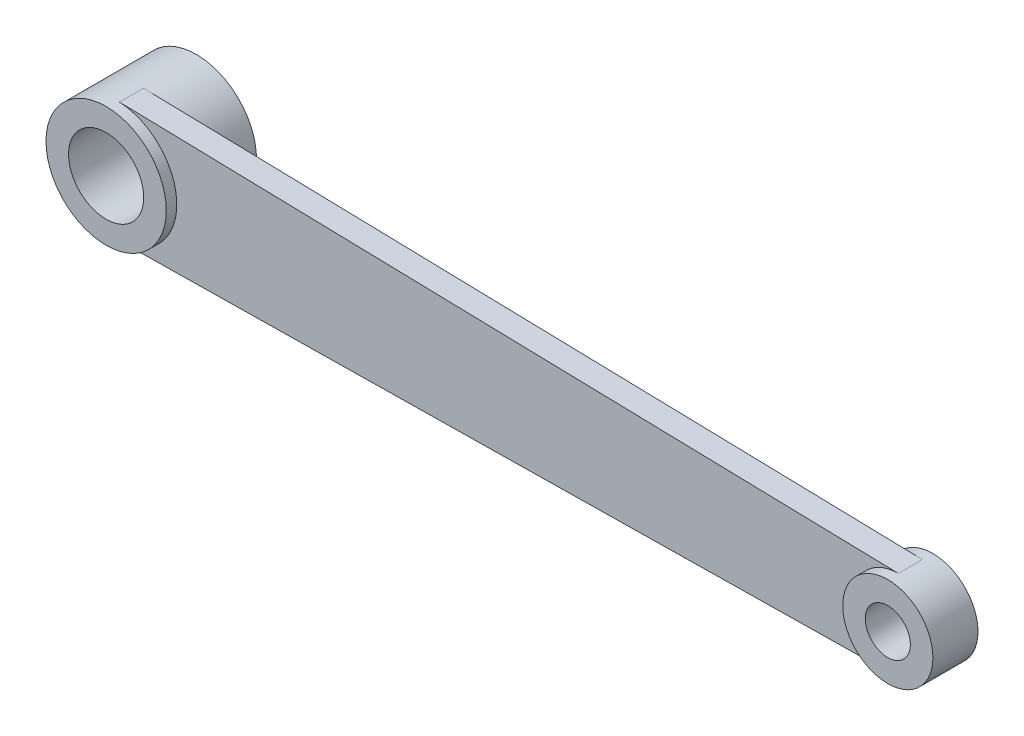
ISO-10303-21;
HEADER;
FILE_DESCRIPTION(('STEP AP214'),'2;1');
FILE_NAME('part.step','',(''),(''),'','','');
FILE_SCHEMA(('AUTOMOTIVE_DESIGN { 1 0 10303 214 1 1 1 1 }'));
ENDSEC;
DATA;
#1=APPLICATION_CONTEXT('core data for automotive mechanical design processes');
#2=APPLICATION_PROTOCOL_DEFINITION('international standard','automotive_design',2000,#1);
#3=PRODUCT_CONTEXT('',#1,'mechanical');
#4=PRODUCT('Part','Part','',(#3));
#5=PRODUCT_RELATED_PRODUCT_CATEGORY('part','',(#4));
#6=PRODUCT_DEFINITION_FORMATION('','',#4);
#7=PRODUCT_DEFINITION_CONTEXT('part definition',#1,'design');
#8=PRODUCT_DEFINITION('design','',#6,#7);
#9=PRODUCT_DEFINITION_SHAPE('','',#8);
#10=(LENGTH_UNIT() NAMED_UNIT(*) SI_UNIT(.MILLI.,.METRE.));
#11=(NAMED_UNIT(*) PLANE_ANGLE_UNIT() SI_UNIT($,.RADIAN.));
#12=(NAMED_UNIT(*) SI_UNIT($,.STERADIAN.) SOLID_ANGLE_UNIT());
#13=UNCERTAINTY_MEASURE_WITH_UNIT(LENGTH_MEASURE(1.E-05),#10,'distance_accuracy_value','');
#14=(GEOMETRIC_REPRESENTATION_CONTEXT(3) GLOBAL_UNCERTAINTY_ASSIGNED_CONTEXT((#13)) GLOBAL_UNIT_ASSIGNED_CONTEXT((#10,
#11,#12)) REPRESENTATION_CONTEXT('',''));
#15=CARTESIAN_POINT('',(0.,0.,0.));
#16=DIRECTION('',(0.,0.,1.));
#17=DIRECTION('',(1.,0.,0.));
#18=AXIS2_PLACEMENT_3D('',#15,#16,#17);
#19=CARTESIAN_POINT('',(0.365782486916927,15.1615884199877,4.));
#20=DIRECTION('',(0.0241185865450105,0.999709104581463,0.));
#21=DIRECTION('',(-0.999709104581463,0.0241185865450105,0.));
#22=AXIS2_PLACEMENT_3D('',#19,#20,#21);
#23=PLANE('',#22);
#24=DIRECTION('',(0.999709104581463,-0.0241185865450105,0.));
#25=VECTOR('',#24,1.);
#26=CARTESIAN_POINT('',(0.365782486916927,15.1615884199877,-4.));
#27=LINE('',#26,#25);
#28=CARTESIAN_POINT('',(-199.220649297423,19.9767317513228,-4.));
#29=VERTEX_POINT('',#28);
#30=CARTESIAN_POINT('',(59.8148878802298,13.7273428110589,-4.));
#31=VERTEX_POINT('',#30);
#32=EDGE_CURVE('E91',#29,#31,#27,.T.);
#33=ORIENTED_EDGE('',*,*,#32,.F.);
#34=DIRECTION('',(0.,0.,-1.));
#35=VECTOR('',#34,1.);
#36=CARTESIAN_POINT('',(-199.220649297423,19.9767317513228,4.));
#37=LINE('',#36,#35);
#38=CARTESIAN_POINT('',(-199.220649297423,19.9767317513228,4.));
#39=VERTEX_POINT('',#38);
#40=EDGE_CURVE('E53',#39,#29,#37,.T.);
#41=ORIENTED_EDGE('',*,*,#40,.F.);
#42=DIRECTION('',(0.999709104581463,-0.0241185865450105,0.));
#43=VECTOR('',#42,1.);
#44=CARTESIAN_POINT('',(0.365782486916927,15.1615884199877,4.));
#45=LINE('',#44,#43);
#46=CARTESIAN_POINT('',(59.8148878802297,13.7273428110589,4.));
#47=VERTEX_POINT('',#46);
#48=EDGE_CURVE('E98',#39,#47,#45,.T.);
#49=ORIENTED_EDGE('',*,*,#48,.T.);
#50=DIRECTION('',(0.,0.,-1.));
#51=VECTOR('',#50,1.);
#52=CARTESIAN_POINT('',(59.8148878802298,13.7273428110589,4.));
#53=LINE('',#52,#51);
#54=EDGE_CURVE('E12',#47,#31,#53,.T.);
#55=ORIENTED_EDGE('',*,*,#54,.T.);
#56=EDGE_LOOP('',(#33,#41,#49,#55));
#57=FACE_BOUND('',#56,.T.);
#58=ADVANCED_FACE('F45',(#57),#23,.T.);
#59=CARTESIAN_POINT('',(0.245526373288944,-17.1266396172959,4.));
#60=DIRECTION('',(-0.0143344609623184,0.99989725633633,0.));
#61=DIRECTION('',(-0.99989725633633,-0.0143344609623184,0.));
#62=AXIS2_PLACEMENT_3D('',#59,#60,#61);
#63=PLANE('',#62);
#64=DIRECTION('',(0.99989725633633,0.0143344609623184,0.));
#65=VECTOR('',#64,1.);
#66=CARTESIAN_POINT('',(0.245526373288944,-17.1266396172959,-4.));
#67=LINE('',#66,#65);
#68=CARTESIAN_POINT('',(-199.61179259228,-19.9917809291568,-4.));
#69=VERTEX_POINT('',#68);
#70=CARTESIAN_POINT('',(59.8148878802298,-16.2726571889411,-4.));
#71=VERTEX_POINT('',#70);
#72=EDGE_CURVE('E104',#69,#71,#67,.T.);
#73=ORIENTED_EDGE('',*,*,#72,.T.);
#74=DIRECTION('',(0.,0.,-1.));
#75=VECTOR('',#74,1.);
#76=CARTESIAN_POINT('',(59.8148878802298,-16.2726571889411,4.));
#77=LINE('',#76,#75);
#78=CARTESIAN_POINT('',(59.8148878802295,-16.2726571889411,4.));
#79=VERTEX_POINT('',#78);
#80=EDGE_CURVE('E60',#79,#71,#77,.T.);
#81=ORIENTED_EDGE('',*,*,#80,.F.);
#82=DIRECTION('',(0.99989725633633,0.0143344609623184,0.));
#83=VECTOR('',#82,1.);
#84=CARTESIAN_POINT('',(0.245526373288944,-17.1266396172959,4.));
#85=LINE('',#84,#83);
#86=CARTESIAN_POINT('',(-199.611792592279,-19.9917809291568,4.));
#87=VERTEX_POINT('',#86);
#88=EDGE_CURVE('E114',#87,#79,#85,.T.);
#89=ORIENTED_EDGE('',*,*,#88,.F.);
#90=DIRECTION('',(0.,0.,-1.));
#91=VECTOR('',#90,1.);
#92=CARTESIAN_POINT('',(-199.61179259228,-19.9917809291568,4.));
#93=LINE('',#92,#91);
#94=EDGE_CURVE('E113',#87,#69,#93,.T.);
#95=ORIENTED_EDGE('',*,*,#94,.T.);
#96=EDGE_LOOP('',(#73,#81,#89,#95));
#97=FACE_BOUND('',#96,.T.);
#98=ADVANCED_FACE('F173',(#97),#63,.F.);
#99=CARTESIAN_POINT('',(0.,0.,4.));
#100=DIRECTION('',(0.,0.,1.));
#101=DIRECTION('',(1.,0.,0.));
#102=AXIS2_PLACEMENT_3D('',#99,#100,#101);
#103=PLANE('',#102);
#104=CARTESIAN_POINT('',(59.8148878802298,-1.27265718894106,4.));
#105=DIRECTION('',(0.,0.,1.));
#106=DIRECTION('',(1.,0.,0.));
#107=AXIS2_PLACEMENT_3D('',#104,#105,#106);
#108=CIRCLE('',#107,15.);
#109=EDGE_CURVE('E110',#47,#79,#108,.T.);
#110=ORIENTED_EDGE('',*,*,#109,.F.);
#111=ORIENTED_EDGE('',*,*,#48,.F.);
#112=CARTESIAN_POINT('',(-200.18511211977,0.,4.));
#113=DIRECTION('',(0.,0.,1.));
#114=DIRECTION('',(1.,0.,0.));
#115=AXIS2_PLACEMENT_3D('',#112,#113,#114);
#116=CIRCLE('',#115,20.);
#117=EDGE_CURVE('E121',#87,#39,#116,.T.);
#118=ORIENTED_EDGE('',*,*,#117,.F.);
#119=ORIENTED_EDGE('',*,*,#88,.T.);
#120=EDGE_LOOP('',(#110,#111,#118,#119));
#121=FACE_BOUND('',#120,.T.);
#122=ADVANCED_FACE('F177',(#121),#103,.T.);
#123=CARTESIAN_POINT('',(0.,0.,-4.));
#124=DIRECTION('',(0.,0.,1.));
#125=DIRECTION('',(1.,0.,0.));
#126=AXIS2_PLACEMENT_3D('',#123,#124,#125);
#127=PLANE('',#126);
#128=CARTESIAN_POINT('',(59.8148878802298,-1.27265718894106,-4.));
#129=DIRECTION('',(0.,0.,1.));
#130=DIRECTION('',(1.,0.,0.));
#131=AXIS2_PLACEMENT_3D('',#128,#129,#130);
#132=CIRCLE('',#131,15.);
#133=EDGE_CURVE('E83',#31,#71,#132,.T.);
#134=ORIENTED_EDGE('',*,*,#133,.T.);
#135=ORIENTED_EDGE('',*,*,#72,.F.);
#136=CARTESIAN_POINT('',(-200.18511211977,0.,-4.));
#137=DIRECTION('',(0.,0.,1.));
#138=DIRECTION('',(1.,0.,0.));
#139=AXIS2_PLACEMENT_3D('',#136,#137,#138);
#140=CIRCLE('',#139,20.);
#141=EDGE_CURVE('E100',#69,#29,#140,.T.);
#142=ORIENTED_EDGE('',*,*,#141,.T.);
#143=ORIENTED_EDGE('',*,*,#32,.T.);
#144=EDGE_LOOP('',(#134,#135,#142,#143));
#145=FACE_BOUND('',#144,.T.);
#146=ADVANCED_FACE('F99',(#145),#127,.F.);
#147=CARTESIAN_POINT('',(-200.18511211977,0.,7.5));
#148=DIRECTION('',(0.,0.,1.));
#149=DIRECTION('',(1.,0.,0.));
#150=AXIS2_PLACEMENT_3D('',#147,#148,#149);
#151=PLANE('',#150);
#152=CARTESIAN_POINT('',(-200.18511211977,0.,7.5));
#153=DIRECTION('',(0.,0.,1.));
#154=DIRECTION('',(1.,0.,0.));
#155=AXIS2_PLACEMENT_3D('',#152,#153,#154);
#156=CIRCLE('',#155,20.);
#157=CARTESIAN_POINT('',(-180.18511211977,0.,7.5));
#158=VERTEX_POINT('',#157);
#159=EDGE_CURVE('E92',#158,#158,#156,.T.);
#160=ORIENTED_EDGE('',*,*,#159,.T.);
#161=EDGE_LOOP('',(#160));
#162=FACE_BOUND('',#161,.T.);
#163=CARTESIAN_POINT('',(-200.18511211977,0.,7.5));
#164=DIRECTION('',(0.,0.,1.));
#165=DIRECTION('',(1.,0.,0.));
#166=AXIS2_PLACEMENT_3D('',#163,#164,#165);
#167=CIRCLE('',#166,12.5);
#168=CARTESIAN_POINT('',(-187.68511211977,0.,7.5));
#169=VERTEX_POINT('',#168);
#170=EDGE_CURVE('E131',#169,#169,#167,.T.);
#171=ORIENTED_EDGE('',*,*,#170,.F.);
#172=EDGE_LOOP('',(#171));
#173=FACE_BOUND('',#172,.T.);
#174=ADVANCED_FACE('F186',(#162,#173),#151,.T.);
#175=CARTESIAN_POINT('',(-200.18511211977,0.,7.5));
#176=DIRECTION('',(0.,0.,-1.));
#177=DIRECTION('',(-1.,0.,0.));
#178=AXIS2_PLACEMENT_3D('',#175,#176,#177);
#179=CYLINDRICAL_SURFACE('',#178,20.);
#180=ORIENTED_EDGE('',*,*,#117,.T.);
#181=ORIENTED_EDGE('',*,*,#40,.T.);
#182=ORIENTED_EDGE('',*,*,#141,.F.);
#183=ORIENTED_EDGE('',*,*,#94,.F.);
#184=EDGE_LOOP('',(#180,#181,#182,#183));
#185=FACE_BOUND('',#184,.T.);
#186=ORIENTED_EDGE('',*,*,#159,.F.);
#187=EDGE_LOOP('',(#186));
#188=FACE_BOUND('',#187,.T.);
#189=CARTESIAN_POINT('',(-200.18511211977,0.,-22.5));
#190=DIRECTION('',(0.,0.,-1.));
#191=DIRECTION('',(-1.,0.,0.));
#192=AXIS2_PLACEMENT_3D('',#189,#190,#191);
#193=CIRCLE('',#192,20.);
#194=CARTESIAN_POINT('',(-220.18511211977,0.,-22.5));
#195=VERTEX_POINT('',#194);
#196=EDGE_CURVE('E148',#195,#195,#193,.T.);
#197=ORIENTED_EDGE('',*,*,#196,.F.);
#198=EDGE_LOOP('',(#197));
#199=FACE_BOUND('',#198,.T.);
#200=ADVANCED_FACE('F188',(#185,#188,#199),#179,.T.);
#201=CARTESIAN_POINT('',(-200.18511211977,0.,7.5));
#202=DIRECTION('',(0.,0.,-1.));
#203=DIRECTION('',(-1.,0.,0.));
#204=AXIS2_PLACEMENT_3D('',#201,#202,#203);
#205=CYLINDRICAL_SURFACE('',#204,12.5);
#206=ORIENTED_EDGE('',*,*,#170,.T.);
#207=EDGE_LOOP('',(#206));
#208=FACE_BOUND('',#207,.T.);
#209=CARTESIAN_POINT('',(-200.18511211977,0.,-22.5));
#210=DIRECTION('',(0.,0.,-1.));
#211=DIRECTION('',(-1.,0.,0.));
#212=AXIS2_PLACEMENT_3D('',#209,#210,#211);
#213=CIRCLE('',#212,12.5);
#214=CARTESIAN_POINT('',(-212.68511211977,0.,-22.5));
#215=VERTEX_POINT('',#214);
#216=EDGE_CURVE('E155',#215,#215,#213,.T.);
#217=ORIENTED_EDGE('',*,*,#216,.T.);
#218=EDGE_LOOP('',(#217));
#219=FACE_BOUND('',#218,.T.);
#220=ADVANCED_FACE('F160',(#208,#219),#205,.F.);
#221=CARTESIAN_POINT('',(59.8148878802298,-1.27265718894106,7.5));
#222=DIRECTION('',(0.,0.,1.));
#223=DIRECTION('',(1.,0.,0.));
#224=AXIS2_PLACEMENT_3D('',#221,#222,#223);
#225=PLANE('',#224);
#226=CARTESIAN_POINT('',(59.8148878802298,-1.27265718894106,7.5));
#227=DIRECTION('',(0.,0.,1.));
#228=DIRECTION('',(1.,0.,0.));
#229=AXIS2_PLACEMENT_3D('',#226,#227,#228);
#230=CIRCLE('',#229,15.);
#231=CARTESIAN_POINT('',(74.8148878802298,-1.27265718894106,7.5));
#232=VERTEX_POINT('',#231);
#233=EDGE_CURVE('E135',#232,#232,#230,.T.);
#234=ORIENTED_EDGE('',*,*,#233,.T.);
#235=EDGE_LOOP('',(#234));
#236=FACE_BOUND('',#235,.T.);
#237=CARTESIAN_POINT('',(59.8148878802298,-1.27265718894106,7.5));
#238=DIRECTION('',(0.,0.,1.));
#239=DIRECTION('',(1.,0.,0.));
#240=AXIS2_PLACEMENT_3D('',#237,#238,#239);
#241=CIRCLE('',#240,7.50000000000001);
#242=CARTESIAN_POINT('',(67.3148878802298,-1.27265718894106,7.5));
#243=VERTEX_POINT('',#242);
#244=EDGE_CURVE('E140',#243,#243,#241,.T.);
#245=ORIENTED_EDGE('',*,*,#244,.F.);
#246=EDGE_LOOP('',(#245));
#247=FACE_BOUND('',#246,.T.);
#248=ADVANCED_FACE('F196',(#236,#247),#225,.T.);
#249=CARTESIAN_POINT('',(59.8148878802298,-1.27265718894106,-7.5));
#250=DIRECTION('',(0.,0.,1.));
#251=DIRECTION('',(1.,0.,0.));
#252=AXIS2_PLACEMENT_3D('',#249,#250,#251);
#253=PLANE('',#252);
#254=CARTESIAN_POINT('',(59.8148878802298,-1.27265718894106,-7.5));
#255=DIRECTION('',(0.,0.,1.));
#256=DIRECTION('',(1.,0.,0.));
#257=AXIS2_PLACEMENT_3D('',#254,#255,#256);
#258=CIRCLE('',#257,15.);
#259=CARTESIAN_POINT('',(74.8148878802298,-1.27265718894106,-7.5));
#260=VERTEX_POINT('',#259);
#261=EDGE_CURVE('E136',#260,#260,#258,.T.);
#262=ORIENTED_EDGE('',*,*,#261,.F.);
#263=EDGE_LOOP('',(#262));
#264=FACE_BOUND('',#263,.T.);
#265=CARTESIAN_POINT('',(59.8148878802298,-1.27265718894106,-7.5));
#266=DIRECTION('',(0.,0.,1.));
#267=DIRECTION('',(1.,0.,0.));
#268=AXIS2_PLACEMENT_3D('',#265,#266,#267);
#269=CIRCLE('',#268,7.50000000000001);
#270=CARTESIAN_POINT('',(67.3148878802298,-1.27265718894106,-7.5));
#271=VERTEX_POINT('',#270);
#272=EDGE_CURVE('E144',#271,#271,#269,.T.);
#273=ORIENTED_EDGE('',*,*,#272,.T.);
#274=EDGE_LOOP('',(#273));
#275=FACE_BOUND('',#274,.T.);
#276=ADVANCED_FACE('F200',(#264,#275),#253,.F.);
#277=CARTESIAN_POINT('',(59.8148878802298,-1.27265718894106,7.5));
#278=DIRECTION('',(0.,0.,-1.));
#279=DIRECTION('',(-1.,0.,0.));
#280=AXIS2_PLACEMENT_3D('',#277,#278,#279);
#281=CYLINDRICAL_SURFACE('',#280,15.);
#282=ORIENTED_EDGE('',*,*,#109,.T.);
#283=ORIENTED_EDGE('',*,*,#80,.T.);
#284=ORIENTED_EDGE('',*,*,#133,.F.);
#285=ORIENTED_EDGE('',*,*,#54,.F.);
#286=EDGE_LOOP('',(#282,#283,#284,#285));
#287=FACE_BOUND('',#286,.T.);
#288=ORIENTED_EDGE('',*,*,#233,.F.);
#289=EDGE_LOOP('',(#288));
#290=FACE_BOUND('',#289,.T.);
#291=ORIENTED_EDGE('',*,*,#261,.T.);
#292=EDGE_LOOP('',(#291));
#293=FACE_BOUND('',#292,.T.);
#294=ADVANCED_FACE('F84',(#287,#290,#293),#281,.T.);
#295=CARTESIAN_POINT('',(59.8148878802298,-1.27265718894106,7.5));
#296=DIRECTION('',(0.,0.,-1.));
#297=DIRECTION('',(-1.,0.,0.));
#298=AXIS2_PLACEMENT_3D('',#295,#296,#297);
#299=CYLINDRICAL_SURFACE('',#298,7.50000000000001);
#300=ORIENTED_EDGE('',*,*,#244,.T.);
#301=EDGE_LOOP('',(#300));
#302=FACE_BOUND('',#301,.T.);
#303=ORIENTED_EDGE('',*,*,#272,.F.);
#304=EDGE_LOOP('',(#303));
#305=FACE_BOUND('',#304,.T.);
#306=ADVANCED_FACE('F164',(#302,#305),#299,.F.);
#307=CARTESIAN_POINT('',(-200.18511211977,0.,-22.5));
#308=DIRECTION('',(0.,0.,-1.));
#309=DIRECTION('',(-1.,0.,0.));
#310=AXIS2_PLACEMENT_3D('',#307,#308,#309);
#311=PLANE('',#310);
#312=ORIENTED_EDGE('',*,*,#196,.T.);
#313=EDGE_LOOP('',(#312));
#314=FACE_BOUND('',#313,.T.);
#315=ORIENTED_EDGE('',*,*,#216,.F.);
#316=EDGE_LOOP('',(#315));
#317=FACE_BOUND('',#316,.T.);
#318=ADVANCED_FACE('F162',(#314,#317),#311,.T.);
#319=CLOSED_SHELL('',(#58,#98,#122,#146,#174,#200,#220,#248,#276,#294,#306,#318));
#320=MANIFOLD_SOLID_BREP('B2',#319);
#321=ADVANCED_BREP_SHAPE_REPRESENTATION('',(#18,#320),#14);
#322=SHAPE_DEFINITION_REPRESENTATION(#9,#321);
ENDSEC;
END-ISO-10303-21;
